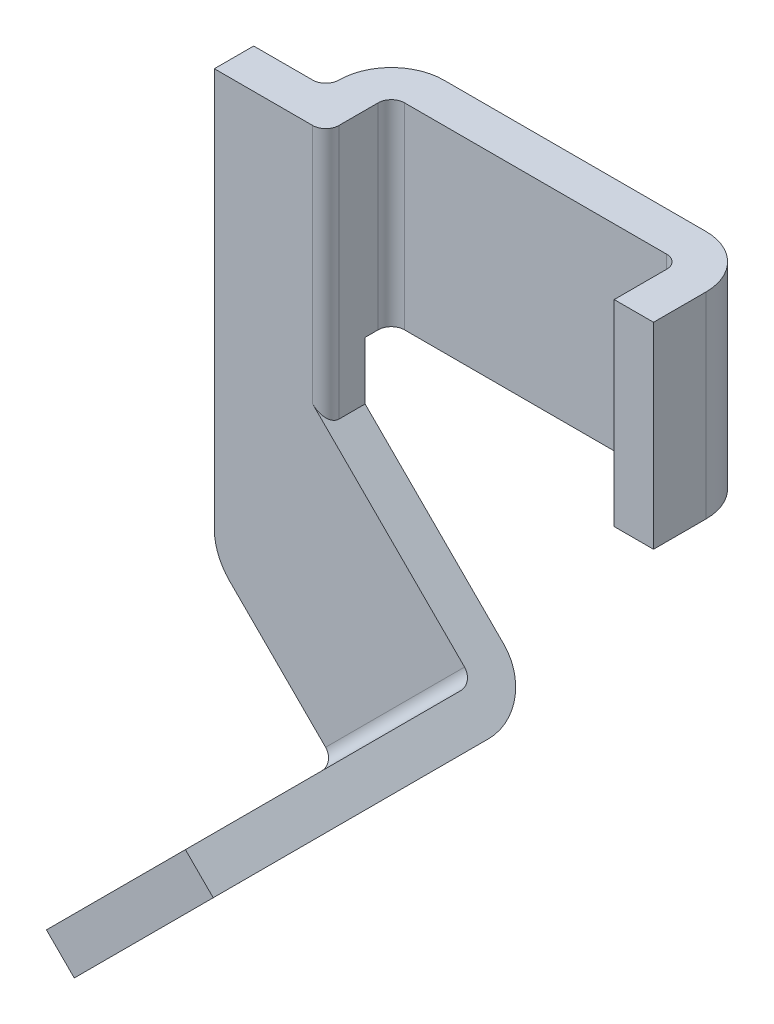
ISO-10303-21;
HEADER;
FILE_DESCRIPTION(('STEP AP214'),'2;1');
FILE_NAME('part.step','',(''),(''),'','','');
FILE_SCHEMA(('AUTOMOTIVE_DESIGN { 1 0 10303 214 1 1 1 1 }'));
ENDSEC;
DATA;
#1=APPLICATION_CONTEXT('core data for automotive mechanical design processes');
#2=APPLICATION_PROTOCOL_DEFINITION('international standard','automotive_design',2000,#1);
#3=PRODUCT_CONTEXT('',#1,'mechanical');
#4=PRODUCT('Part','Part','',(#3));
#5=PRODUCT_RELATED_PRODUCT_CATEGORY('part','',(#4));
#6=PRODUCT_DEFINITION_FORMATION('','',#4);
#7=PRODUCT_DEFINITION_CONTEXT('part definition',#1,'design');
#8=PRODUCT_DEFINITION('design','',#6,#7);
#9=PRODUCT_DEFINITION_SHAPE('','',#8);
#10=(LENGTH_UNIT() NAMED_UNIT(*) SI_UNIT(.MILLI.,.METRE.));
#11=(NAMED_UNIT(*) PLANE_ANGLE_UNIT() SI_UNIT($,.RADIAN.));
#12=(NAMED_UNIT(*) SI_UNIT($,.STERADIAN.) SOLID_ANGLE_UNIT());
#13=UNCERTAINTY_MEASURE_WITH_UNIT(LENGTH_MEASURE(1.E-05),#10,'distance_accuracy_value','');
#14=(GEOMETRIC_REPRESENTATION_CONTEXT(3) GLOBAL_UNCERTAINTY_ASSIGNED_CONTEXT((#13)) GLOBAL_UNIT_ASSIGNED_CONTEXT((#10,
#11,#12)) REPRESENTATION_CONTEXT('',''));
#15=CARTESIAN_POINT('',(0.,0.,0.));
#16=DIRECTION('',(0.,0.,1.));
#17=DIRECTION('',(1.,0.,0.));
#18=AXIS2_PLACEMENT_3D('',#15,#16,#17);
#19=CARTESIAN_POINT('',(-6.199999999999,10.5,2.));
#20=DIRECTION('',(1.,0.,0.));
#21=DIRECTION('',(0.,1.,0.));
#22=AXIS2_PLACEMENT_3D('',#19,#20,#21);
#23=PLANE('',#22);
#24=DIRECTION('',(0.,-1.,0.));
#25=VECTOR('',#24,1.);
#26=CARTESIAN_POINT('',(-6.200000000009,10.50000000001,2.50000000001));
#27=LINE('',#26,#25);
#28=CARTESIAN_POINT('',(-6.199999999999,10.5,2.5));
#29=VERTEX_POINT('',#28);
#30=CARTESIAN_POINT('',(-6.199999999999,9.,2.5));
#31=VERTEX_POINT('',#30);
#32=EDGE_CURVE('E11',#29,#31,#27,.T.);
#33=ORIENTED_EDGE('',*,*,#32,.T.);
#34=DIRECTION('',(0.,0.,1.));
#35=VECTOR('',#34,1.);
#36=CARTESIAN_POINT('',(-6.200000000009,9.00000000001,2.10000000001));
#37=LINE('',#36,#35);
#38=CARTESIAN_POINT('',(-6.199999999999,9.,2.1));
#39=VERTEX_POINT('',#38);
#40=EDGE_CURVE('E40',#39,#31,#37,.T.);
#41=ORIENTED_EDGE('',*,*,#40,.F.);
#42=DIRECTION('',(0.,-1.,0.));
#43=VECTOR('',#42,1.);
#44=CARTESIAN_POINT('',(-6.200000000009,10.50000000001,2.10000000001));
#45=LINE('',#44,#43);
#46=CARTESIAN_POINT('',(-6.199999999999,10.5,2.1));
#47=VERTEX_POINT('',#46);
#48=EDGE_CURVE('E484',#47,#39,#45,.T.);
#49=ORIENTED_EDGE('',*,*,#48,.F.);
#50=DIRECTION('',(0.,0.,-1.));
#51=VECTOR('',#50,1.);
#52=CARTESIAN_POINT('',(-6.200000000009,10.50000000001,2.50000000001));
#53=LINE('',#52,#51);
#54=EDGE_CURVE('E483',#29,#47,#53,.T.);
#55=ORIENTED_EDGE('',*,*,#54,.F.);
#56=EDGE_LOOP('',(#33,#41,#49,#55));
#57=FACE_BOUND('',#56,.T.);
#58=ADVANCED_FACE('F16',(#57),#23,.T.);
#59=CARTESIAN_POINT('',(-9.549999999999,10.5,2.2));
#60=DIRECTION('',(0.,-1.,0.));
#61=DIRECTION('',(0.,0.,-1.));
#62=AXIS2_PLACEMENT_3D('',#59,#60,#61);
#63=PLANE('',#62);
#64=DIRECTION('',(-1.,0.,0.));
#65=VECTOR('',#64,1.);
#66=CARTESIAN_POINT('',(-6.600000000009,10.50000000001,1.70000000001));
#67=LINE('',#66,#65);
#68=CARTESIAN_POINT('',(-6.599999999999,10.5,1.7));
#69=VERTEX_POINT('',#68);
#70=CARTESIAN_POINT('',(-8.599999999999,10.5,1.7));
#71=VERTEX_POINT('',#70);
#72=EDGE_CURVE('E27',#69,#71,#67,.T.);
#73=ORIENTED_EDGE('',*,*,#72,.T.);
#74=CARTESIAN_POINT('',(-8.600000000009,10.50000000001,2.10000000001));
#75=DIRECTION('',(0.,1.,0.));
#76=DIRECTION('',(0.,0.,-1.));
#77=AXIS2_PLACEMENT_3D('',#74,#75,#76);
#78=CIRCLE('',#77,0.40000000001);
#79=CARTESIAN_POINT('',(-8.999999999999,10.5,2.1));
#80=VERTEX_POINT('',#79);
#81=EDGE_CURVE('E495',#71,#80,#78,.T.);
#82=ORIENTED_EDGE('',*,*,#81,.T.);
#83=CARTESIAN_POINT('',(-9.100000000009,10.50000000001,2.10000000001));
#84=DIRECTION('',(0.,-1.,0.));
#85=DIRECTION('',(1.,0.,-1.00017763558392E-10));
#86=AXIS2_PLACEMENT_3D('',#83,#84,#85);
#87=CIRCLE('',#86,0.10000000001);
#88=CARTESIAN_POINT('',(-9.099999999999,10.5,2.2));
#89=VERTEX_POINT('',#88);
#90=EDGE_CURVE('E458',#80,#89,#87,.T.);
#91=ORIENTED_EDGE('',*,*,#90,.T.);
#92=DIRECTION('',(-1.,0.,0.));
#93=VECTOR('',#92,1.);
#94=CARTESIAN_POINT('',(-9.100000000009,10.50000000001,2.20000000001));
#95=LINE('',#94,#93);
#96=CARTESIAN_POINT('',(-9.549999999999,10.5,2.2));
#97=VERTEX_POINT('',#96);
#98=EDGE_CURVE('E454',#89,#97,#95,.T.);
#99=ORIENTED_EDGE('',*,*,#98,.T.);
#100=DIRECTION('',(0.,0.,1.));
#101=VECTOR('',#100,1.);
#102=CARTESIAN_POINT('',(-9.550000000009,10.50000000001,2.20000000001));
#103=LINE('',#102,#101);
#104=CARTESIAN_POINT('',(-9.549999999999,10.5,2.5));
#105=VERTEX_POINT('',#104);
#106=EDGE_CURVE('E345',#97,#105,#103,.T.);
#107=ORIENTED_EDGE('',*,*,#106,.T.);
#108=DIRECTION('',(1.,0.,0.));
#109=VECTOR('',#108,1.);
#110=CARTESIAN_POINT('',(-9.550000000009,10.50000000001,2.50000000001));
#111=LINE('',#110,#109);
#112=CARTESIAN_POINT('',(-8.799999999999,10.5,2.5));
#113=VERTEX_POINT('',#112);
#114=EDGE_CURVE('E341',#105,#113,#111,.T.);
#115=ORIENTED_EDGE('',*,*,#114,.T.);
#116=CARTESIAN_POINT('',(-8.800000000009,10.50000000001,2.40000000001));
#117=DIRECTION('',(0.,1.,0.));
#118=DIRECTION('',(0.,0.,1.));
#119=AXIS2_PLACEMENT_3D('',#116,#117,#118);
#120=CIRCLE('',#119,0.10000000001);
#121=CARTESIAN_POINT('',(-8.699999999999,10.5,2.4));
#122=VERTEX_POINT('',#121);
#123=EDGE_CURVE('E260',#113,#122,#120,.T.);
#124=ORIENTED_EDGE('',*,*,#123,.T.);
#125=DIRECTION('',(0.,0.,-1.));
#126=VECTOR('',#125,1.);
#127=CARTESIAN_POINT('',(-8.700000000009,10.50000000001,2.40000000001));
#128=LINE('',#127,#126);
#129=CARTESIAN_POINT('',(-8.699999999999,10.5,2.1));
#130=VERTEX_POINT('',#129);
#131=EDGE_CURVE('E256',#122,#130,#128,.T.);
#132=ORIENTED_EDGE('',*,*,#131,.T.);
#133=CARTESIAN_POINT('',(-8.600000000009,10.50000000001,2.10000000001));
#134=DIRECTION('',(0.,-1.,0.));
#135=DIRECTION('',(-1.,0.,0.));
#136=AXIS2_PLACEMENT_3D('',#133,#134,#135);
#137=CIRCLE('',#136,0.10000000001);
#138=CARTESIAN_POINT('',(-8.599999999999,10.5,2.));
#139=VERTEX_POINT('',#138);
#140=EDGE_CURVE('E236',#130,#139,#137,.T.);
#141=ORIENTED_EDGE('',*,*,#140,.T.);
#142=DIRECTION('',(-1.,0.,0.));
#143=VECTOR('',#142,1.);
#144=CARTESIAN_POINT('',(-6.600000000009,10.50000000001,2.00000000001));
#145=LINE('',#144,#143);
#146=CARTESIAN_POINT('',(-6.599999999999,10.5,2.));
#147=VERTEX_POINT('',#146);
#148=EDGE_CURVE('E231',#147,#139,#145,.T.);
#149=ORIENTED_EDGE('',*,*,#148,.F.);
#150=CARTESIAN_POINT('',(-6.600000000009,10.50000000001,2.10000000001));
#151=DIRECTION('',(0.,-1.,0.));
#152=DIRECTION('',(0.,0.,-1.));
#153=AXIS2_PLACEMENT_3D('',#150,#151,#152);
#154=CIRCLE('',#153,0.10000000001);
#155=CARTESIAN_POINT('',(-6.499999999999,10.5,2.1));
#156=VERTEX_POINT('',#155);
#157=EDGE_CURVE('E227',#147,#156,#154,.T.);
#158=ORIENTED_EDGE('',*,*,#157,.T.);
#159=DIRECTION('',(0.,0.,-1.));
#160=VECTOR('',#159,1.);
#161=CARTESIAN_POINT('',(-6.500000000009,10.50000000001,2.50000000001));
#162=LINE('',#161,#160);
#163=CARTESIAN_POINT('',(-6.499999999999,10.5,2.5));
#164=VERTEX_POINT('',#163);
#165=EDGE_CURVE('E213',#164,#156,#162,.T.);
#166=ORIENTED_EDGE('',*,*,#165,.F.);
#167=DIRECTION('',(1.,0.,0.));
#168=VECTOR('',#167,1.);
#169=CARTESIAN_POINT('',(-6.500000000009,10.50000000001,2.50000000001));
#170=LINE('',#169,#168);
#171=EDGE_CURVE('E237',#164,#29,#170,.T.);
#172=ORIENTED_EDGE('',*,*,#171,.T.);
#173=ORIENTED_EDGE('',*,*,#54,.T.);
#174=CARTESIAN_POINT('',(-6.600000000009,10.50000000001,2.10000000001));
#175=DIRECTION('',(0.,1.,0.));
#176=DIRECTION('',(1.,0.,0.));
#177=AXIS2_PLACEMENT_3D('',#174,#175,#176);
#178=CIRCLE('',#177,0.40000000001);
#179=EDGE_CURVE('E480',#47,#69,#178,.T.);
#180=ORIENTED_EDGE('',*,*,#179,.T.);
#181=EDGE_LOOP('',(#73,#82,#91,#99,#107,#115,#124,#132,#141,#149,#158,#166,#172,#173,#180));
#182=FACE_BOUND('',#181,.T.);
#183=ADVANCED_FACE('F229',(#182),#63,.F.);
#184=CARTESIAN_POINT('',(-6.599999999999,10.5,2.1));
#185=DIRECTION('',(0.,-1.,0.));
#186=DIRECTION('',(0.,0.,-1.));
#187=AXIS2_PLACEMENT_3D('',#184,#185,#186);
#188=CYLINDRICAL_SURFACE('',#187,0.4);
#189=ORIENTED_EDGE('',*,*,#48,.T.);
#190=CARTESIAN_POINT('',(-6.600000000009,9.00000000001,2.10000000001));
#191=DIRECTION('',(0.,-1.,0.));
#192=DIRECTION('',(0.,0.,-1.));
#193=AXIS2_PLACEMENT_3D('',#190,#191,#192);
#194=CIRCLE('',#193,0.40000000001);
#195=CARTESIAN_POINT('',(-6.599999999999,9.,1.7));
#196=VERTEX_POINT('',#195);
#197=EDGE_CURVE('E321',#196,#39,#194,.T.);
#198=ORIENTED_EDGE('',*,*,#197,.F.);
#199=DIRECTION('',(0.,1.,0.));
#200=VECTOR('',#199,1.);
#201=CARTESIAN_POINT('',(-6.600000000009,9.00000000001,1.70000000001));
#202=LINE('',#201,#200);
#203=EDGE_CURVE('E525',#196,#69,#202,.T.);
#204=ORIENTED_EDGE('',*,*,#203,.T.);
#205=ORIENTED_EDGE('',*,*,#179,.F.);
#206=EDGE_LOOP('',(#189,#198,#204,#205));
#207=FACE_BOUND('',#206,.T.);
#208=ADVANCED_FACE('F822',(#207),#188,.T.);
#209=CARTESIAN_POINT('',(-8.699999999999,10.5,1.7));
#210=DIRECTION('',(0.,0.,-1.));
#211=DIRECTION('',(0.,-1.,0.));
#212=AXIS2_PLACEMENT_3D('',#209,#210,#211);
#213=PLANE('',#212);
#214=DIRECTION('',(0.,-1.,0.));
#215=VECTOR('',#214,1.);
#216=CARTESIAN_POINT('',(-8.600000000009,10.50000000001,1.70000000001));
#217=LINE('',#216,#215);
#218=CARTESIAN_POINT('',(-8.599999999999,9.,1.7));
#219=VERTEX_POINT('',#218);
#220=EDGE_CURVE('E310',#71,#219,#217,.T.);
#221=ORIENTED_EDGE('',*,*,#220,.F.);
#222=ORIENTED_EDGE('',*,*,#72,.F.);
#223=ORIENTED_EDGE('',*,*,#203,.F.);
#224=DIRECTION('',(1.,0.,0.));
#225=VECTOR('',#224,1.);
#226=CARTESIAN_POINT('',(-8.600000000009,9.00000000001,1.70000000001));
#227=LINE('',#226,#225);
#228=EDGE_CURVE('E266',#219,#196,#227,.T.);
#229=ORIENTED_EDGE('',*,*,#228,.F.);
#230=EDGE_LOOP('',(#221,#222,#223,#229));
#231=FACE_BOUND('',#230,.T.);
#232=ADVANCED_FACE('F373',(#231),#213,.T.);
#233=CARTESIAN_POINT('',(-8.699999999999,9.,1.7));
#234=DIRECTION('',(0.,1.,0.));
#235=DIRECTION('',(1.,0.,0.));
#236=AXIS2_PLACEMENT_3D('',#233,#234,#235);
#237=PLANE('',#236);
#238=ORIENTED_EDGE('',*,*,#40,.T.);
#239=DIRECTION('',(-1.,0.,0.));
#240=VECTOR('',#239,1.);
#241=CARTESIAN_POINT('',(-6.200000000009,9.00000000001,2.50000000001));
#242=LINE('',#241,#240);
#243=CARTESIAN_POINT('',(-6.499999999999,9.,2.5));
#244=VERTEX_POINT('',#243);
#245=EDGE_CURVE('E300',#31,#244,#242,.T.);
#246=ORIENTED_EDGE('',*,*,#245,.T.);
#247=DIRECTION('',(0.,0.,1.));
#248=VECTOR('',#247,1.);
#249=CARTESIAN_POINT('',(-6.500000000009,9.00000000001,2.10000000001));
#250=LINE('',#249,#248);
#251=CARTESIAN_POINT('',(-6.499999999999,9.,2.1));
#252=VERTEX_POINT('',#251);
#253=EDGE_CURVE('E251',#252,#244,#250,.T.);
#254=ORIENTED_EDGE('',*,*,#253,.F.);
#255=CARTESIAN_POINT('',(-6.600000000009,9.00000000001,2.10000000001));
#256=DIRECTION('',(0.,1.,0.));
#257=DIRECTION('',(1.,0.,0.));
#258=AXIS2_PLACEMENT_3D('',#255,#256,#257);
#259=CIRCLE('',#258,0.10000000001);
#260=CARTESIAN_POINT('',(-6.599999999999,9.,2.));
#261=VERTEX_POINT('',#260);
#262=EDGE_CURVE('E242',#252,#261,#259,.T.);
#263=ORIENTED_EDGE('',*,*,#262,.T.);
#264=DIRECTION('',(1.,0.,0.));
#265=VECTOR('',#264,1.);
#266=CARTESIAN_POINT('',(-8.600000000009,9.00000000001,2.00000000001));
#267=LINE('',#266,#265);
#268=CARTESIAN_POINT('',(-8.599999999999,9.,2.));
#269=VERTEX_POINT('',#268);
#270=EDGE_CURVE('E249',#269,#261,#267,.T.);
#271=ORIENTED_EDGE('',*,*,#270,.F.);
#272=CARTESIAN_POINT('',(-8.600000000009,9.00000000001,2.10000000001));
#273=DIRECTION('',(0.,1.,0.));
#274=DIRECTION('',(0.,0.,-1.));
#275=AXIS2_PLACEMENT_3D('',#272,#273,#274);
#276=CIRCLE('',#275,0.10000000001);
#277=CARTESIAN_POINT('',(-8.699999999999,9.,2.1));
#278=VERTEX_POINT('',#277);
#279=EDGE_CURVE('E281',#269,#278,#276,.T.);
#280=ORIENTED_EDGE('',*,*,#279,.T.);
#281=DIRECTION('',(0.,0.,1.));
#282=VECTOR('',#281,1.);
#283=CARTESIAN_POINT('',(-8.700000000009,9.00000000001,2.10000000001));
#284=LINE('',#283,#282);
#285=CARTESIAN_POINT('',(-8.699999999999,9.,2.2));
#286=VERTEX_POINT('',#285);
#287=EDGE_CURVE('E277',#278,#286,#284,.T.);
#288=ORIENTED_EDGE('',*,*,#287,.T.);
#289=DIRECTION('',(-1.,0.,0.));
#290=VECTOR('',#289,1.);
#291=CARTESIAN_POINT('',(-8.700000000009,9.00000000001,2.20000000001));
#292=LINE('',#291,#290);
#293=CARTESIAN_POINT('',(-9.099999999999,9.,2.2));
#294=VERTEX_POINT('',#293);
#295=EDGE_CURVE('E282',#286,#294,#292,.T.);
#296=ORIENTED_EDGE('',*,*,#295,.T.);
#297=CARTESIAN_POINT('',(-9.100000000009,9.00000000001,2.10000000001));
#298=DIRECTION('',(0.,1.,0.));
#299=DIRECTION('',(0.,0.,1.));
#300=AXIS2_PLACEMENT_3D('',#297,#298,#299);
#301=CIRCLE('',#300,0.10000000001);
#302=CARTESIAN_POINT('',(-8.999999999999,9.,2.1));
#303=VERTEX_POINT('',#302);
#304=EDGE_CURVE('E265',#294,#303,#301,.T.);
#305=ORIENTED_EDGE('',*,*,#304,.T.);
#306=CARTESIAN_POINT('',(-8.600000000009,9.00000000001,2.10000000001));
#307=DIRECTION('',(0.,-1.,0.));
#308=DIRECTION('',(-1.,0.,0.));
#309=AXIS2_PLACEMENT_3D('',#306,#307,#308);
#310=CIRCLE('',#309,0.40000000001);
#311=EDGE_CURVE('E261',#303,#219,#310,.T.);
#312=ORIENTED_EDGE('',*,*,#311,.T.);
#313=ORIENTED_EDGE('',*,*,#228,.T.);
#314=ORIENTED_EDGE('',*,*,#197,.T.);
#315=EDGE_LOOP('',(#238,#246,#254,#263,#271,#280,#288,#296,#305,#312,#313,#314));
#316=FACE_BOUND('',#315,.T.);
#317=ADVANCED_FACE('F589',(#316),#237,.F.);
#318=CARTESIAN_POINT('',(-8.599999999999,10.5,2.1));
#319=DIRECTION('',(0.,1.,0.));
#320=DIRECTION('',(1.,0.,0.));
#321=AXIS2_PLACEMENT_3D('',#318,#319,#320);
#322=CYLINDRICAL_SURFACE('',#321,0.4);
#323=ORIENTED_EDGE('',*,*,#220,.T.);
#324=ORIENTED_EDGE('',*,*,#311,.F.);
#325=DIRECTION('',(0.,-1.,0.));
#326=VECTOR('',#325,1.);
#327=CARTESIAN_POINT('',(-9.000000000009,10.50000000001,2.10000000001));
#328=LINE('',#327,#326);
#329=EDGE_CURVE('E306',#80,#303,#328,.T.);
#330=ORIENTED_EDGE('',*,*,#329,.F.);
#331=ORIENTED_EDGE('',*,*,#81,.F.);
#332=EDGE_LOOP('',(#323,#324,#330,#331));
#333=FACE_BOUND('',#332,.T.);
#334=ADVANCED_FACE('F772',(#333),#322,.T.);
#335=CARTESIAN_POINT('',(-9.099999999999,9.,2.1));
#336=DIRECTION('',(0.,1.,0.));
#337=DIRECTION('',(1.,0.,0.));
#338=AXIS2_PLACEMENT_3D('',#335,#336,#337);
#339=CYLINDRICAL_SURFACE('',#338,0.1);
#340=ORIENTED_EDGE('',*,*,#329,.T.);
#341=ORIENTED_EDGE('',*,*,#304,.F.);
#342=DIRECTION('',(0.,1.,0.));
#343=VECTOR('',#342,1.);
#344=CARTESIAN_POINT('',(-9.100000000009,9.00000000001,2.20000000001));
#345=LINE('',#344,#343);
#346=EDGE_CURVE('E311',#294,#89,#345,.T.);
#347=ORIENTED_EDGE('',*,*,#346,.T.);
#348=ORIENTED_EDGE('',*,*,#90,.F.);
#349=EDGE_LOOP('',(#340,#341,#347,#348));
#350=FACE_BOUND('',#349,.T.);
#351=ADVANCED_FACE('F397',(#350),#339,.F.);
#352=CARTESIAN_POINT('',(-8.630761184456,6.370761184457,2.2));
#353=DIRECTION('',(0.,0.,1.));
#354=DIRECTION('',(1.,0.,0.));
#355=AXIS2_PLACEMENT_3D('',#352,#353,#354);
#356=PLANE('',#355);
#357=DIRECTION('',(-0.707106781186597,0.707106781186498,0.));
#358=VECTOR('',#357,1.);
#359=CARTESIAN_POINT('',(-8.701471862585,6.441471862586,2.20000000001));
#360=LINE('',#359,#358);
#361=CARTESIAN_POINT('',(-8.701471862575,6.441471862576,2.2));
#362=VERTEX_POINT('',#361);
#363=CARTESIAN_POINT('',(-9.432842712475,7.172842712475,2.2));
#364=VERTEX_POINT('',#363);
#365=EDGE_CURVE('E502',#362,#364,#360,.T.);
#366=ORIENTED_EDGE('',*,*,#365,.T.);
#367=CARTESIAN_POINT('',(-9.150000000009,7.455685424959,2.20000000001));
#368=DIRECTION('',(0.,0.,-1.));
#369=DIRECTION('',(-0.707106781190198,-0.707106781182898,0.));
#370=AXIS2_PLACEMENT_3D('',#367,#368,#369);
#371=CIRCLE('',#370,0.400000000014142);
#372=CARTESIAN_POINT('',(-9.549999999999,7.455685424949,2.2));
#373=VERTEX_POINT('',#372);
#374=EDGE_CURVE('E333',#364,#373,#371,.T.);
#375=ORIENTED_EDGE('',*,*,#374,.T.);
#376=DIRECTION('',(0.,-1.,0.));
#377=VECTOR('',#376,1.);
#378=CARTESIAN_POINT('',(-9.550000000009,10.50000000001,2.20000000001));
#379=LINE('',#378,#377);
#380=EDGE_CURVE('E270',#97,#373,#379,.T.);
#381=ORIENTED_EDGE('',*,*,#380,.F.);
#382=ORIENTED_EDGE('',*,*,#98,.F.);
#383=ORIENTED_EDGE('',*,*,#346,.F.);
#384=ORIENTED_EDGE('',*,*,#295,.F.);
#385=DIRECTION('',(0.,1.,0.));
#386=VECTOR('',#385,1.);
#387=CARTESIAN_POINT('',(-8.700000000009,8.56000000001,2.20000000001));
#388=LINE('',#387,#386);
#389=CARTESIAN_POINT('',(-8.699999999999,8.56,2.2));
#390=VERTEX_POINT('',#389);
#391=EDGE_CURVE('E350',#390,#286,#388,.T.);
#392=ORIENTED_EDGE('',*,*,#391,.F.);
#393=DIRECTION('',(0.707106781186548,-0.707106781186548,0.));
#394=VECTOR('',#393,1.);
#395=CARTESIAN_POINT('',(-8.700000000009,8.56000000001,2.20000000001));
#396=LINE('',#395,#394);
#397=CARTESIAN_POINT('',(-7.641471862575,7.501471862576,2.2));
#398=VERTEX_POINT('',#397);
#399=EDGE_CURVE('E330',#390,#398,#396,.T.);
#400=ORIENTED_EDGE('',*,*,#399,.T.);
#401=DIRECTION('',(-0.707106781186548,-0.707106781186548,0.));
#402=VECTOR('',#401,1.);
#403=CARTESIAN_POINT('',(-7.641471862585,7.501471862586,2.20000000001));
#404=LINE('',#403,#402);
#405=EDGE_CURVE('E334',#398,#362,#404,.T.);
#406=ORIENTED_EDGE('',*,*,#405,.T.);
#407=EDGE_LOOP('',(#366,#375,#381,#382,#383,#384,#392,#400,#406));
#408=FACE_BOUND('',#407,.T.);
#409=ADVANCED_FACE('F393',(#408),#356,.F.);
#410=CARTESIAN_POINT('',(-8.701471862575,6.441471862576,2.6));
#411=DIRECTION('',(-0.707106781186548,-0.707106781186548,0.));
#412=DIRECTION('',(-0.707106781186548,0.707106781186548,0.));
#413=AXIS2_PLACEMENT_3D('',#410,#411,#412);
#414=CYLINDRICAL_SURFACE('',#413,0.4);
#415=ORIENTED_EDGE('',*,*,#405,.F.);
#416=CARTESIAN_POINT('',(-7.641471862585,7.501471862586,2.60000000001));
#417=DIRECTION('',(0.707106781186548,0.707106781186548,0.));
#418=DIRECTION('',(0.707106781186548,-0.707106781186548,-3.86002320502962E-11));
#419=AXIS2_PLACEMENT_3D('',#416,#417,#418);
#420=CIRCLE('',#419,0.400000000014142);
#421=CARTESIAN_POINT('',(-7.358629150101,7.218629150101,2.599999999998));
#422=VERTEX_POINT('',#421);
#423=EDGE_CURVE('E288',#422,#398,#420,.T.);
#424=ORIENTED_EDGE('',*,*,#423,.F.);
#425=DIRECTION('',(-0.707106781186548,-0.707106781186548,0.));
#426=VECTOR('',#425,1.);
#427=CARTESIAN_POINT('',(-7.358629150111,7.218629150111,2.600000000008));
#428=LINE('',#427,#426);
#429=CARTESIAN_POINT('',(-8.418629150101,6.158629150101,2.599999999995));
#430=VERTEX_POINT('',#429);
#431=EDGE_CURVE('E338',#422,#430,#428,.T.);
#432=ORIENTED_EDGE('',*,*,#431,.T.);
#433=CARTESIAN_POINT('',(-8.701471862585,6.441471862586,2.60000000001));
#434=DIRECTION('',(-0.707106781186548,-0.707106781186548,0.));
#435=DIRECTION('',(0.,0.,-1.));
#436=AXIS2_PLACEMENT_3D('',#433,#434,#435);
#437=CIRCLE('',#436,0.40000000001);
#438=EDGE_CURVE('E299',#362,#430,#437,.T.);
#439=ORIENTED_EDGE('',*,*,#438,.F.);
#440=EDGE_LOOP('',(#415,#424,#432,#439));
#441=FACE_BOUND('',#440,.T.);
#442=ADVANCED_FACE('F389',(#441),#414,.T.);
#443=CARTESIAN_POINT('',(-9.549999999999,7.29,2.2));
#444=DIRECTION('',(0.707106781186548,0.707106781186548,0.));
#445=DIRECTION('',(0.,0.,-1.));
#446=AXIS2_PLACEMENT_3D('',#443,#444,#445);
#447=PLANE('',#446);
#448=DIRECTION('',(-4.82111665652389E-12,4.82238548283774E-12,1.));
#449=VECTOR('',#448,1.);
#450=CARTESIAN_POINT('',(-8.418629150111,6.158629150111,2.600000000008));
#451=LINE('',#450,#449);
#452=CARTESIAN_POINT('',(-8.418629150101,6.158629150101,4.7));
#453=VERTEX_POINT('',#452);
#454=EDGE_CURVE('E463',#430,#453,#451,.T.);
#455=ORIENTED_EDGE('',*,*,#454,.T.);
#456=DIRECTION('',(0.707106781186548,-0.707106781186548,0.));
#457=VECTOR('',#456,1.);
#458=CARTESIAN_POINT('',(-8.630761184466,6.370761184467,4.70000000001));
#459=LINE('',#458,#457);
#460=CARTESIAN_POINT('',(-8.630761184456,6.370761184457,4.7));
#461=VERTEX_POINT('',#460);
#462=EDGE_CURVE('E275',#461,#453,#459,.T.);
#463=ORIENTED_EDGE('',*,*,#462,.F.);
#464=DIRECTION('',(-4.81688723548461E-12,4.81646429337999E-12,-1.));
#465=VECTOR('',#464,1.);
#466=CARTESIAN_POINT('',(-8.630761184466,6.370761184467,4.70000000001));
#467=LINE('',#466,#465);
#468=CARTESIAN_POINT('',(-8.630761184456,6.370761184457,2.600000000001));
#469=VERTEX_POINT('',#468);
#470=EDGE_CURVE('E298',#461,#469,#467,.T.);
#471=ORIENTED_EDGE('',*,*,#470,.T.);
#472=CARTESIAN_POINT('',(-8.701471862585,6.441471862586,2.60000000001));
#473=DIRECTION('',(0.707106781186548,0.707106781186548,0.));
#474=DIRECTION('',(0.707106781186548,-0.707106781186548,1.36974867592751E-10));
#475=AXIS2_PLACEMENT_3D('',#472,#473,#474);
#476=CIRCLE('',#475,0.100000000014142);
#477=CARTESIAN_POINT('',(-8.701471862575,6.441471862576,2.5));
#478=VERTEX_POINT('',#477);
#479=EDGE_CURVE('E294',#469,#478,#476,.T.);
#480=ORIENTED_EDGE('',*,*,#479,.T.);
#481=DIRECTION('',(0.707106781186597,-0.707106781186498,0.));
#482=VECTOR('',#481,1.);
#483=CARTESIAN_POINT('',(-9.432842712485,7.172842712485,2.50000000001));
#484=LINE('',#483,#482);
#485=CARTESIAN_POINT('',(-9.432842712475,7.172842712475,2.5));
#486=VERTEX_POINT('',#485);
#487=EDGE_CURVE('E437',#486,#478,#484,.T.);
#488=ORIENTED_EDGE('',*,*,#487,.F.);
#489=DIRECTION('',(0.,0.,1.));
#490=VECTOR('',#489,1.);
#491=CARTESIAN_POINT('',(-9.432842712485,7.172842712485,2.20000000001));
#492=LINE('',#491,#490);
#493=EDGE_CURVE('E316',#364,#486,#492,.T.);
#494=ORIENTED_EDGE('',*,*,#493,.F.);
#495=ORIENTED_EDGE('',*,*,#365,.F.);
#496=ORIENTED_EDGE('',*,*,#438,.T.);
#497=EDGE_LOOP('',(#455,#463,#471,#480,#488,#494,#495,#496));
#498=FACE_BOUND('',#497,.T.);
#499=ADVANCED_FACE('F392',(#498),#447,.F.);
#500=CARTESIAN_POINT('',(-9.149999999999,7.455685424949,2.2));
#501=DIRECTION('',(0.,0.,-1.));
#502=DIRECTION('',(0.,1.,0.));
#503=AXIS2_PLACEMENT_3D('',#500,#501,#502);
#504=CYLINDRICAL_SURFACE('',#503,0.4);
#505=DIRECTION('',(0.,0.,-1.));
#506=VECTOR('',#505,1.);
#507=CARTESIAN_POINT('',(-9.550000000009,7.455685424959,2.50000000001));
#508=LINE('',#507,#506);
#509=CARTESIAN_POINT('',(-9.549999999999,7.455685424949,2.5));
#510=VERTEX_POINT('',#509);
#511=EDGE_CURVE('E305',#510,#373,#508,.T.);
#512=ORIENTED_EDGE('',*,*,#511,.T.);
#513=ORIENTED_EDGE('',*,*,#374,.F.);
#514=ORIENTED_EDGE('',*,*,#493,.T.);
#515=CARTESIAN_POINT('',(-9.150000000009,7.455685424959,2.50000000001));
#516=DIRECTION('',(0.,0.,1.));
#517=DIRECTION('',(-1.,-2.50466292671392E-11,0.));
#518=AXIS2_PLACEMENT_3D('',#515,#516,#517);
#519=CIRCLE('',#518,0.40000000001);
#520=EDGE_CURVE('E320',#510,#486,#519,.T.);
#521=ORIENTED_EDGE('',*,*,#520,.F.);
#522=EDGE_LOOP('',(#512,#513,#514,#521));
#523=FACE_BOUND('',#522,.T.);
#524=ADVANCED_FACE('F403',(#523),#504,.T.);
#525=CARTESIAN_POINT('',(-8.630761184456,6.370761184457,2.5));
#526=DIRECTION('',(0.,0.,1.));
#527=DIRECTION('',(1.,0.,0.));
#528=AXIS2_PLACEMENT_3D('',#525,#526,#527);
#529=PLANE('',#528);
#530=ORIENTED_EDGE('',*,*,#114,.F.);
#531=DIRECTION('',(0.,1.,0.));
#532=VECTOR('',#531,1.);
#533=CARTESIAN_POINT('',(-9.550000000009,7.455685424959,2.50000000001));
#534=LINE('',#533,#532);
#535=EDGE_CURVE('E224',#510,#105,#534,.T.);
#536=ORIENTED_EDGE('',*,*,#535,.F.);
#537=ORIENTED_EDGE('',*,*,#520,.T.);
#538=ORIENTED_EDGE('',*,*,#487,.T.);
#539=DIRECTION('',(0.707106781186548,0.707106781186548,0.));
#540=VECTOR('',#539,1.);
#541=CARTESIAN_POINT('',(-8.701471862585,6.441471862586,2.50000000001));
#542=LINE('',#541,#540);
#543=CARTESIAN_POINT('',(-7.641471862575,7.501471862576,2.5));
#544=VERTEX_POINT('',#543);
#545=EDGE_CURVE('E431',#478,#544,#542,.T.);
#546=ORIENTED_EDGE('',*,*,#545,.T.);
#547=DIRECTION('',(-0.707106781186548,0.707106781186548,0.));
#548=VECTOR('',#547,1.);
#549=CARTESIAN_POINT('',(-7.641471862585,7.501471862586,2.50000000001));
#550=LINE('',#549,#548);
#551=CARTESIAN_POINT('',(-8.799999999999,8.66,2.5));
#552=VERTEX_POINT('',#551);
#553=EDGE_CURVE('E417',#544,#552,#550,.T.);
#554=ORIENTED_EDGE('',*,*,#553,.T.);
#555=DIRECTION('',(0.,-1.,0.));
#556=VECTOR('',#555,1.);
#557=CARTESIAN_POINT('',(-8.800000000009,10.50000000001,2.50000000001));
#558=LINE('',#557,#556);
#559=EDGE_CURVE('E418',#113,#552,#558,.T.);
#560=ORIENTED_EDGE('',*,*,#559,.F.);
#561=EDGE_LOOP('',(#530,#536,#537,#538,#546,#554,#560));
#562=FACE_BOUND('',#561,.T.);
#563=ADVANCED_FACE('F18',(#562),#529,.T.);
#564=CARTESIAN_POINT('',(-8.799999999999,10.5,2.4));
#565=DIRECTION('',(0.,-1.,0.));
#566=DIRECTION('',(0.,0.,-1.));
#567=AXIS2_PLACEMENT_3D('',#564,#565,#566);
#568=CYLINDRICAL_SURFACE('',#567,0.1);
#569=DIRECTION('',(0.,1.,0.));
#570=VECTOR('',#569,1.);
#571=CARTESIAN_POINT('',(-8.700000000009,8.56000000001,2.40000000001));
#572=LINE('',#571,#570);
#573=CARTESIAN_POINT('',(-8.699999999999,8.56,2.4));
#574=VERTEX_POINT('',#573);
#575=EDGE_CURVE('E408',#574,#122,#572,.T.);
#576=ORIENTED_EDGE('',*,*,#575,.T.);
#577=ORIENTED_EDGE('',*,*,#123,.F.);
#578=ORIENTED_EDGE('',*,*,#559,.T.);
#579=CARTESIAN_POINT('',(-8.700000000009,8.56000000001,2.40000000001));
#580=CARTESIAN_POINT('',(-8.700000000009,8.56000000001,2.42329429084901));
#581=CARTESIAN_POINT('',(-8.7107640924601,8.5707640924611,2.44513261353847));
#582=CARTESIAN_POINT('',(-8.71864464248089,8.57864464248189,2.46112077000463));
#583=CARTESIAN_POINT('',(-8.7329160919417,8.5929160919427,2.4741602944971));
#584=CARTESIAN_POINT('',(-8.76119703512505,8.62119703512606,2.50000000001));
#585=CARTESIAN_POINT('',(-8.800000000009,8.66000000001,2.50000000001));
#586=B_SPLINE_CURVE_WITH_KNOTS('',2,(#579,#580,#581,#582,#583,#584,#585),.UNSPECIFIED.,.F.,.F.,
(3,2,2,3),(0.,0.25,0.5,1.),.UNSPECIFIED.);
#587=EDGE_CURVE('E328',#574,#552,#586,.T.);
#588=ORIENTED_EDGE('',*,*,#587,.F.);
#589=EDGE_LOOP('',(#576,#577,#578,#588));
#590=FACE_BOUND('',#589,.T.);
#591=ADVANCED_FACE('F372',(#590),#568,.T.);
#592=CARTESIAN_POINT('',(-8.699999999999,8.56,2.2));
#593=DIRECTION('',(-0.707106781186548,-0.707106781186548,0.));
#594=DIRECTION('',(-0.707106781186548,0.707106781186548,0.));
#595=AXIS2_PLACEMENT_3D('',#592,#593,#594);
#596=PLANE('',#595);
#597=ORIENTED_EDGE('',*,*,#399,.F.);
#598=DIRECTION('',(0.,0.,1.));
#599=VECTOR('',#598,1.);
#600=CARTESIAN_POINT('',(-8.700000000009,8.56000000001,2.20000000001));
#601=LINE('',#600,#599);
#602=EDGE_CURVE('E421',#390,#574,#601,.T.);
#603=ORIENTED_EDGE('',*,*,#602,.T.);
#604=ORIENTED_EDGE('',*,*,#587,.T.);
#605=ORIENTED_EDGE('',*,*,#553,.F.);
#606=CARTESIAN_POINT('',(-7.641471862585,7.501471862586,2.60000000001));
#607=DIRECTION('',(-0.707106781186548,-0.707106781186548,0.));
#608=DIRECTION('',(0.,0.,-1.));
#609=AXIS2_PLACEMENT_3D('',#606,#607,#608);
#610=CIRCLE('',#609,0.10000000001);
#611=CARTESIAN_POINT('',(-7.570761184456,7.430761184457,2.600000000001));
#612=VERTEX_POINT('',#611);
#613=EDGE_CURVE('E324',#544,#612,#610,.T.);
#614=ORIENTED_EDGE('',*,*,#613,.T.);
#615=DIRECTION('',(4.81646429337999E-12,-4.81688723548461E-12,1.));
#616=VECTOR('',#615,1.);
#617=CARTESIAN_POINT('',(-7.570761184466,7.430761184467,2.600000000011));
#618=LINE('',#617,#616);
#619=CARTESIAN_POINT('',(-7.570761184456,7.430761184457,4.7));
#620=VERTEX_POINT('',#619);
#621=EDGE_CURVE('E329',#612,#620,#618,.T.);
#622=ORIENTED_EDGE('',*,*,#621,.T.);
#623=DIRECTION('',(-0.707106781186297,0.707106781186798,0.));
#624=VECTOR('',#623,1.);
#625=CARTESIAN_POINT('',(-7.358629150111,7.218629150111,4.70000000001));
#626=LINE('',#625,#624);
#627=CARTESIAN_POINT('',(-7.358629150101,7.218629150101,4.7));
#628=VERTEX_POINT('',#627);
#629=EDGE_CURVE('E293',#628,#620,#626,.T.);
#630=ORIENTED_EDGE('',*,*,#629,.F.);
#631=DIRECTION('',(4.86002733014863E-12,-4.78432069342223E-12,-1.));
#632=VECTOR('',#631,1.);
#633=CARTESIAN_POINT('',(-7.358629150111,7.218629150111,4.70000000001));
#634=LINE('',#633,#632);
#635=EDGE_CURVE('E292',#628,#422,#634,.T.);
#636=ORIENTED_EDGE('',*,*,#635,.T.);
#637=ORIENTED_EDGE('',*,*,#423,.T.);
#638=EDGE_LOOP('',(#597,#603,#604,#605,#614,#622,#630,#636,#637));
#639=FACE_BOUND('',#638,.T.);
#640=ADVANCED_FACE('F361',(#639),#596,.F.);
#641=CARTESIAN_POINT('',(-7.358629150101,7.218629150101,4.7));
#642=DIRECTION('',(0.707106781186548,-0.707106781186548,0.));
#643=DIRECTION('',(0.,0.,-1.));
#644=AXIS2_PLACEMENT_3D('',#641,#642,#643);
#645=PLANE('',#644);
#646=DIRECTION('',(0.707106781186548,0.707106781186548,0.));
#647=VECTOR('',#646,1.);
#648=CARTESIAN_POINT('',(-8.418629150111,6.158629150111,4.70000000001));
#649=LINE('',#648,#647);
#650=EDGE_CURVE('E271',#453,#628,#649,.T.);
#651=ORIENTED_EDGE('',*,*,#650,.F.);
#652=ORIENTED_EDGE('',*,*,#454,.F.);
#653=ORIENTED_EDGE('',*,*,#431,.F.);
#654=ORIENTED_EDGE('',*,*,#635,.F.);
#655=EDGE_LOOP('',(#651,#652,#653,#654));
#656=FACE_BOUND('',#655,.T.);
#657=ADVANCED_FACE('F371',(#656),#645,.T.);
#658=CARTESIAN_POINT('',(-8.630761184456,6.370761184457,4.7));
#659=DIRECTION('',(0.,0.,-1.));
#660=DIRECTION('',(0.,-1.,0.));
#661=AXIS2_PLACEMENT_3D('',#658,#659,#660);
#662=PLANE('',#661);
#663=ORIENTED_EDGE('',*,*,#629,.T.);
#664=DIRECTION('',(-0.707106781186548,-0.707106781186548,0.));
#665=VECTOR('',#664,1.);
#666=CARTESIAN_POINT('',(-7.570761184466,7.430761184467,4.70000000001));
#667=LINE('',#666,#665);
#668=EDGE_CURVE('E312',#620,#461,#667,.T.);
#669=ORIENTED_EDGE('',*,*,#668,.T.);
#670=ORIENTED_EDGE('',*,*,#462,.T.);
#671=ORIENTED_EDGE('',*,*,#650,.T.);
#672=EDGE_LOOP('',(#663,#669,#670,#671));
#673=FACE_BOUND('',#672,.T.);
#674=ADVANCED_FACE('F379',(#673),#662,.F.);
#675=CARTESIAN_POINT('',(-8.630761184456,6.370761184457,4.7));
#676=DIRECTION('',(-0.707106781186548,0.707106781186548,0.));
#677=DIRECTION('',(0.,0.,1.));
#678=AXIS2_PLACEMENT_3D('',#675,#676,#677);
#679=PLANE('',#678);
#680=ORIENTED_EDGE('',*,*,#668,.F.);
#681=ORIENTED_EDGE('',*,*,#621,.F.);
#682=DIRECTION('',(0.707106781186548,0.707106781186548,0.));
#683=VECTOR('',#682,1.);
#684=CARTESIAN_POINT('',(-8.630761184466,6.370761184467,2.600000000011));
#685=LINE('',#684,#683);
#686=EDGE_CURVE('E276',#469,#612,#685,.T.);
#687=ORIENTED_EDGE('',*,*,#686,.F.);
#688=ORIENTED_EDGE('',*,*,#470,.F.);
#689=EDGE_LOOP('',(#680,#681,#687,#688));
#690=FACE_BOUND('',#689,.T.);
#691=ADVANCED_FACE('F375',(#690),#679,.T.);
#692=CARTESIAN_POINT('',(-8.701471862575,6.441471862576,2.6));
#693=DIRECTION('',(-0.707106781186548,-0.707106781186548,0.));
#694=DIRECTION('',(-0.707106781186548,0.707106781186548,0.));
#695=AXIS2_PLACEMENT_3D('',#692,#693,#694);
#696=CYLINDRICAL_SURFACE('',#695,0.1);
#697=ORIENTED_EDGE('',*,*,#686,.T.);
#698=ORIENTED_EDGE('',*,*,#613,.F.);
#699=ORIENTED_EDGE('',*,*,#545,.F.);
#700=ORIENTED_EDGE('',*,*,#479,.F.);
#701=EDGE_LOOP('',(#697,#698,#699,#700));
#702=FACE_BOUND('',#701,.T.);
#703=ADVANCED_FACE('F378',(#702),#696,.F.);
#704=CARTESIAN_POINT('',(-8.699999999999,10.5,2.2));
#705=DIRECTION('',(-1.,0.,0.));
#706=DIRECTION('',(0.,0.,1.));
#707=AXIS2_PLACEMENT_3D('',#704,#705,#706);
#708=PLANE('',#707);
#709=ORIENTED_EDGE('',*,*,#131,.F.);
#710=ORIENTED_EDGE('',*,*,#575,.F.);
#711=ORIENTED_EDGE('',*,*,#602,.F.);
#712=ORIENTED_EDGE('',*,*,#391,.T.);
#713=ORIENTED_EDGE('',*,*,#287,.F.);
#714=DIRECTION('',(0.,-1.,0.));
#715=VECTOR('',#714,1.);
#716=CARTESIAN_POINT('',(-8.700000000009,10.50000000001,2.10000000001));
#717=LINE('',#716,#715);
#718=EDGE_CURVE('E351',#130,#278,#717,.T.);
#719=ORIENTED_EDGE('',*,*,#718,.F.);
#720=EDGE_LOOP('',(#709,#710,#711,#712,#713,#719));
#721=FACE_BOUND('',#720,.T.);
#722=ADVANCED_FACE('F381',(#721),#708,.F.);
#723=CARTESIAN_POINT('',(-8.599999999999,10.5,2.1));
#724=DIRECTION('',(0.,-1.,0.));
#725=DIRECTION('',(0.,0.,-1.));
#726=AXIS2_PLACEMENT_3D('',#723,#724,#725);
#727=CYLINDRICAL_SURFACE('',#726,0.1);
#728=DIRECTION('',(0.,1.,0.));
#729=VECTOR('',#728,1.);
#730=CARTESIAN_POINT('',(-8.600000000009,9.00000000001,2.00000000001));
#731=LINE('',#730,#729);
#732=EDGE_CURVE('E346',#269,#139,#731,.T.);
#733=ORIENTED_EDGE('',*,*,#732,.T.);
#734=ORIENTED_EDGE('',*,*,#140,.F.);
#735=ORIENTED_EDGE('',*,*,#718,.T.);
#736=ORIENTED_EDGE('',*,*,#279,.F.);
#737=EDGE_LOOP('',(#733,#734,#735,#736));
#738=FACE_BOUND('',#737,.T.);
#739=ADVANCED_FACE('F384',(#738),#727,.F.);
#740=CARTESIAN_POINT('',(-6.199999999999,10.5,2.));
#741=DIRECTION('',(0.,0.,-1.));
#742=DIRECTION('',(0.,-1.,0.));
#743=AXIS2_PLACEMENT_3D('',#740,#741,#742);
#744=PLANE('',#743);
#745=ORIENTED_EDGE('',*,*,#270,.T.);
#746=DIRECTION('',(0.,-1.,0.));
#747=VECTOR('',#746,1.);
#748=CARTESIAN_POINT('',(-6.600000000009,10.50000000001,2.00000000001));
#749=LINE('',#748,#747);
#750=EDGE_CURVE('E244',#147,#261,#749,.T.);
#751=ORIENTED_EDGE('',*,*,#750,.F.);
#752=ORIENTED_EDGE('',*,*,#148,.T.);
#753=ORIENTED_EDGE('',*,*,#732,.F.);
#754=EDGE_LOOP('',(#745,#751,#752,#753));
#755=FACE_BOUND('',#754,.T.);
#756=ADVANCED_FACE('F609',(#755),#744,.F.);
#757=CARTESIAN_POINT('',(-6.599999999999,10.5,2.1));
#758=DIRECTION('',(0.,-1.,0.));
#759=DIRECTION('',(0.,0.,-1.));
#760=AXIS2_PLACEMENT_3D('',#757,#758,#759);
#761=CYLINDRICAL_SURFACE('',#760,0.1);
#762=DIRECTION('',(0.,1.,0.));
#763=VECTOR('',#762,1.);
#764=CARTESIAN_POINT('',(-6.500000000009,9.00000000001,2.10000000001));
#765=LINE('',#764,#763);
#766=EDGE_CURVE('E217',#252,#156,#765,.T.);
#767=ORIENTED_EDGE('',*,*,#766,.T.);
#768=ORIENTED_EDGE('',*,*,#157,.F.);
#769=ORIENTED_EDGE('',*,*,#750,.T.);
#770=ORIENTED_EDGE('',*,*,#262,.F.);
#771=EDGE_LOOP('',(#767,#768,#769,#770));
#772=FACE_BOUND('',#771,.T.);
#773=ADVANCED_FACE('F240',(#772),#761,.F.);
#774=CARTESIAN_POINT('',(-6.499999999999,10.5,2.5));
#775=DIRECTION('',(1.,0.,0.));
#776=DIRECTION('',(0.,1.,0.));
#777=AXIS2_PLACEMENT_3D('',#774,#775,#776);
#778=PLANE('',#777);
#779=ORIENTED_EDGE('',*,*,#253,.T.);
#780=DIRECTION('',(0.,1.,0.));
#781=VECTOR('',#780,1.);
#782=CARTESIAN_POINT('',(-6.500000000009,9.00000000001,2.50000000001));
#783=LINE('',#782,#781);
#784=EDGE_CURVE('E219',#244,#164,#783,.T.);
#785=ORIENTED_EDGE('',*,*,#784,.T.);
#786=ORIENTED_EDGE('',*,*,#165,.T.);
#787=ORIENTED_EDGE('',*,*,#766,.F.);
#788=EDGE_LOOP('',(#779,#785,#786,#787));
#789=FACE_BOUND('',#788,.T.);
#790=ADVANCED_FACE('F215',(#789),#778,.F.);
#791=CARTESIAN_POINT('',(-6.199999999999,10.5,2.5));
#792=DIRECTION('',(0.,0.,1.));
#793=DIRECTION('',(1.,0.,0.));
#794=AXIS2_PLACEMENT_3D('',#791,#792,#793);
#795=PLANE('',#794);
#796=ORIENTED_EDGE('',*,*,#245,.F.);
#797=ORIENTED_EDGE('',*,*,#32,.F.);
#798=ORIENTED_EDGE('',*,*,#171,.F.);
#799=ORIENTED_EDGE('',*,*,#784,.F.);
#800=EDGE_LOOP('',(#796,#797,#798,#799));
#801=FACE_BOUND('',#800,.T.);
#802=ADVANCED_FACE('F612',(#801),#795,.T.);
#803=CARTESIAN_POINT('',(-9.549999999999,7.29,2.2));
#804=DIRECTION('',(1.,0.,0.));
#805=DIRECTION('',(0.,1.,0.));
#806=AXIS2_PLACEMENT_3D('',#803,#804,#805);
#807=PLANE('',#806);
#808=ORIENTED_EDGE('',*,*,#535,.T.);
#809=ORIENTED_EDGE('',*,*,#106,.F.);
#810=ORIENTED_EDGE('',*,*,#380,.T.);
#811=ORIENTED_EDGE('',*,*,#511,.F.);
#812=EDGE_LOOP('',(#808,#809,#810,#811));
#813=FACE_BOUND('',#812,.T.);
#814=ADVANCED_FACE('F583',(#813),#807,.F.);
#815=CLOSED_SHELL('',(#58,#183,#208,#232,#317,#334,#351,#409,#442,#499,#524,#563,#591,#640,#657,
#674,#691,#703,#722,#739,#756,#773,#790,#802,#814));
#816=MANIFOLD_SOLID_BREP('B1',#815);
#817=ADVANCED_BREP_SHAPE_REPRESENTATION('',(#18,#816),#14);
#818=SHAPE_DEFINITION_REPRESENTATION(#9,#817);
ENDSEC;
END-ISO-10303-21;
